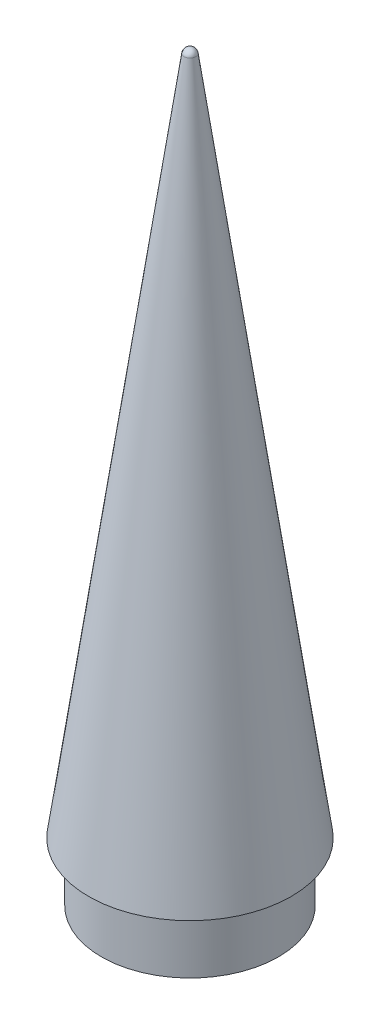
ISO-10303-21;
HEADER;
FILE_DESCRIPTION(('STEP AP214'),'2;1');
FILE_NAME('part.step','',(''),(''),'','','');
FILE_SCHEMA(('AUTOMOTIVE_DESIGN { 1 0 10303 214 1 1 1 1 }'));
ENDSEC;
DATA;
#1=APPLICATION_CONTEXT('core data for automotive mechanical design processes');
#2=APPLICATION_PROTOCOL_DEFINITION('international standard','automotive_design',2000,#1);
#3=PRODUCT_CONTEXT('',#1,'mechanical');
#4=PRODUCT('Part','Part','',(#3));
#5=PRODUCT_RELATED_PRODUCT_CATEGORY('part','',(#4));
#6=PRODUCT_DEFINITION_FORMATION('','',#4);
#7=PRODUCT_DEFINITION_CONTEXT('part definition',#1,'design');
#8=PRODUCT_DEFINITION('design','',#6,#7);
#9=PRODUCT_DEFINITION_SHAPE('','',#8);
#10=(LENGTH_UNIT() NAMED_UNIT(*) SI_UNIT(.MILLI.,.METRE.));
#11=(NAMED_UNIT(*) PLANE_ANGLE_UNIT() SI_UNIT($,.RADIAN.));
#12=(NAMED_UNIT(*) SI_UNIT($,.STERADIAN.) SOLID_ANGLE_UNIT());
#13=UNCERTAINTY_MEASURE_WITH_UNIT(LENGTH_MEASURE(1.E-05),#10,'distance_accuracy_value','');
#14=(GEOMETRIC_REPRESENTATION_CONTEXT(3) GLOBAL_UNCERTAINTY_ASSIGNED_CONTEXT((#13)) GLOBAL_UNIT_ASSIGNED_CONTEXT((#10,
#11,#12)) REPRESENTATION_CONTEXT('',''));
#15=CARTESIAN_POINT('',(0.,0.,0.));
#16=DIRECTION('',(0.,0.,1.));
#17=DIRECTION('',(1.,0.,0.));
#18=AXIS2_PLACEMENT_3D('',#15,#16,#17);
#19=CARTESIAN_POINT('',(0.,159.635365985492,0.));
#20=DIRECTION('',(0.,-1.,0.));
#21=DIRECTION('',(-1.,0.,0.));
#22=AXIS2_PLACEMENT_3D('',#19,#20,#21);
#23=SPHERICAL_SURFACE('',#22,1.27);
#24=CARTESIAN_POINT('',(0.,159.812115823711,0.));
#25=DIRECTION('',(0.,-1.,0.));
#26=DIRECTION('',(1.,0.,0.));
#27=AXIS2_PLACEMENT_3D('',#24,#25,#26);
#28=CIRCLE('',#27,1.25764044730179);
#29=CARTESIAN_POINT('',(1.25764044730179,159.812115823711,0.));
#30=VERTEX_POINT('',#29);
#31=EDGE_CURVE('E75',#30,#30,#28,.T.);
#32=ORIENTED_EDGE('',*,*,#31,.F.);
#33=EDGE_LOOP('',(#32));
#34=FACE_BOUND('',#33,.T.);
#35=ADVANCED_FACE('F53',(#34),#23,.T.);
#36=CARTESIAN_POINT('',(0.,0.,0.));
#37=DIRECTION('',(0.,1.,0.));
#38=DIRECTION('',(-1.,0.,0.));
#39=AXIS2_PLACEMENT_3D('',#36,#37,#38);
#40=PLANE('',#39);
#41=CARTESIAN_POINT('',(0.,0.,0.));
#42=DIRECTION('',(0.,-1.,0.));
#43=DIRECTION('',(0.,0.,-1.));
#44=AXIS2_PLACEMENT_3D('',#41,#42,#43);
#45=CIRCLE('',#44,2.55269999999999);
#46=CARTESIAN_POINT('',(0.,0.,-2.55269999999999));
#47=VERTEX_POINT('',#46);
#48=EDGE_CURVE('E76',#47,#47,#45,.T.);
#49=ORIENTED_EDGE('',*,*,#48,.F.);
#50=EDGE_LOOP('',(#49));
#51=FACE_BOUND('',#50,.T.);
#52=CARTESIAN_POINT('',(0.,0.,0.));
#53=DIRECTION('',(0.,-1.,0.));
#54=DIRECTION('',(1.,0.,0.));
#55=AXIS2_PLACEMENT_3D('',#52,#53,#54);
#56=CIRCLE('',#55,19.177);
#57=CARTESIAN_POINT('',(19.177,0.,0.));
#58=VERTEX_POINT('',#57);
#59=EDGE_CURVE('E11',#58,#58,#56,.T.);
#60=ORIENTED_EDGE('',*,*,#59,.T.);
#61=EDGE_LOOP('',(#60));
#62=FACE_BOUND('',#61,.T.);
#63=ADVANCED_FACE('F108',(#51,#62),#40,.F.);
#64=CARTESIAN_POINT('',(0.,0.,0.));
#65=DIRECTION('',(0.,-1.,0.));
#66=DIRECTION('',(1.,0.,0.));
#67=AXIS2_PLACEMENT_3D('',#64,#65,#66);
#68=CYLINDRICAL_SURFACE('',#67,19.177);
#69=ORIENTED_EDGE('',*,*,#59,.F.);
#70=EDGE_LOOP('',(#69));
#71=FACE_BOUND('',#70,.T.);
#72=CARTESIAN_POINT('',(0.,12.7,0.));
#73=DIRECTION('',(0.,-1.,0.));
#74=DIRECTION('',(1.,0.,0.));
#75=AXIS2_PLACEMENT_3D('',#72,#73,#74);
#76=CIRCLE('',#75,19.177);
#77=CARTESIAN_POINT('',(19.177,12.7,0.));
#78=VERTEX_POINT('',#77);
#79=EDGE_CURVE('E60',#78,#78,#76,.T.);
#80=ORIENTED_EDGE('',*,*,#79,.T.);
#81=EDGE_LOOP('',(#80));
#82=FACE_BOUND('',#81,.T.);
#83=ADVANCED_FACE('F94',(#71,#82),#68,.T.);
#84=CARTESIAN_POINT('',(0.,12.7,0.));
#85=DIRECTION('',(0.,1.,0.));
#86=DIRECTION('',(-1.,0.,0.));
#87=AXIS2_PLACEMENT_3D('',#84,#85,#86);
#88=PLANE('',#87);
#89=ORIENTED_EDGE('',*,*,#79,.F.);
#90=EDGE_LOOP('',(#89));
#91=FACE_BOUND('',#90,.T.);
#92=CARTESIAN_POINT('',(0.,12.7,0.));
#93=DIRECTION('',(0.,-1.,0.));
#94=DIRECTION('',(1.,0.,0.));
#95=AXIS2_PLACEMENT_3D('',#92,#93,#94);
#96=CIRCLE('',#95,21.9329);
#97=CARTESIAN_POINT('',(21.9329,12.7,0.));
#98=VERTEX_POINT('',#97);
#99=EDGE_CURVE('E82',#98,#98,#96,.T.);
#100=ORIENTED_EDGE('',*,*,#99,.T.);
#101=EDGE_LOOP('',(#100));
#102=FACE_BOUND('',#101,.T.);
#103=ADVANCED_FACE('F96',(#91,#102),#88,.F.);
#104=CARTESIAN_POINT('',(0.,159.812115823711,0.));
#105=DIRECTION('',(0.,-1.,0.));
#106=DIRECTION('',(1.,0.,0.));
#107=AXIS2_PLACEMENT_3D('',#104,#105,#106);
#108=CONICAL_SURFACE('',#107,1.25764044730179,0.13962634015954);
#109=CARTESIAN_POINT('',(21.9329,12.7,0.));
#110=CARTESIAN_POINT('',(21.7175327129927,14.2324178731636,0.));
#111=CARTESIAN_POINT('',(21.5021654259854,15.7648357463273,0.));
#112=CARTESIAN_POINT('',(21.0714308519709,18.8296714926546,0.));
#113=CARTESIAN_POINT('',(20.8560635649636,20.3620893658183,0.));
#114=CARTESIAN_POINT('',(20.4253289909491,23.4269251121456,0.));
#115=CARTESIAN_POINT('',(20.2099617039418,24.9593429853092,0.));
#116=CARTESIAN_POINT('',(19.7792271299273,28.0241787316365,0.));
#117=CARTESIAN_POINT('',(19.56385984292,29.5565966048002,0.));
#118=CARTESIAN_POINT('',(19.1331252689054,32.6214323511275,0.));
#119=CARTESIAN_POINT('',(18.9177579818982,34.1538502242912,0.));
#120=CARTESIAN_POINT('',(18.4870234078836,37.2186859706185,0.));
#121=CARTESIAN_POINT('',(18.2716561208764,38.7511038437821,0.));
#122=CARTESIAN_POINT('',(17.8409215468618,41.8159395901094,0.));
#123=CARTESIAN_POINT('',(17.6255542598545,43.3483574632731,0.));
#124=CARTESIAN_POINT('',(17.19481968584,46.4131932096004,0.));
#125=CARTESIAN_POINT('',(16.9794523988327,47.9456110827641,0.));
#126=CARTESIAN_POINT('',(16.5487178248182,51.0104468290914,0.));
#127=CARTESIAN_POINT('',(16.3333505378109,52.542864702255,0.));
#128=CARTESIAN_POINT('',(15.9026159637963,55.6077004485823,0.));
#129=CARTESIAN_POINT('',(15.6872486767891,57.140118321746,0.));
#130=CARTESIAN_POINT('',(15.2565141027745,60.2049540680733,0.));
#131=CARTESIAN_POINT('',(15.0411468157673,61.737371941237,0.));
#132=CARTESIAN_POINT('',(14.6104122417527,64.8022076875643,0.));
#133=CARTESIAN_POINT('',(14.3950449547454,66.3346255607279,0.));
#134=CARTESIAN_POINT('',(13.9643103807309,69.3994613070552,0.));
#135=CARTESIAN_POINT('',(13.7489430937236,70.9318791802189,0.));
#136=CARTESIAN_POINT('',(13.3182085197091,73.9967149265462,0.));
#137=CARTESIAN_POINT('',(13.1028412327018,75.5291327997099,0.));
#138=CARTESIAN_POINT('',(12.6721066586873,78.5939685460372,0.));
#139=CARTESIAN_POINT('',(12.45673937168,80.1263864192008,0.));
#140=CARTESIAN_POINT('',(12.0260047976654,83.1912221655281,0.));
#141=CARTESIAN_POINT('',(11.8106375106582,84.7236400386918,0.));
#142=CARTESIAN_POINT('',(11.3799029366436,87.7884757850191,0.));
#143=CARTESIAN_POINT('',(11.1645356496363,89.3208936581828,0.));
#144=CARTESIAN_POINT('',(10.7338010756218,92.3857294045101,0.));
#145=CARTESIAN_POINT('',(10.5184337886145,93.9181472776737,0.));
#146=CARTESIAN_POINT('',(10.0876992146,96.982983024001,0.));
#147=CARTESIAN_POINT('',(9.87233192759271,98.5154008971647,0.));
#148=CARTESIAN_POINT('',(9.44159735357816,101.580236643492,0.));
#149=CARTESIAN_POINT('',(9.22623006657089,103.112654516656,0.));
#150=CARTESIAN_POINT('',(8.79549549255634,106.177490262983,0.));
#151=CARTESIAN_POINT('',(8.58012820554907,107.709908136147,0.));
#152=CARTESIAN_POINT('',(8.14939363153453,110.774743882474,0.));
#153=CARTESIAN_POINT('',(7.93402634452725,112.307161755638,0.));
#154=CARTESIAN_POINT('',(7.50329177051271,115.371997501965,0.));
#155=CARTESIAN_POINT('',(7.28792448350543,116.904415375129,0.));
#156=CARTESIAN_POINT('',(6.85718990949089,119.969251121456,0.));
#157=CARTESIAN_POINT('',(6.64182262248361,121.50166899462,0.));
#158=CARTESIAN_POINT('',(6.21108804846907,124.566504740947,0.));
#159=CARTESIAN_POINT('',(5.9957207614618,126.09892261411,0.));
#160=CARTESIAN_POINT('',(5.56498618744725,129.163758360438,0.));
#161=CARTESIAN_POINT('',(5.34961890043998,130.696176233601,0.));
#162=CARTESIAN_POINT('',(4.91888432642543,133.761011979929,0.));
#163=CARTESIAN_POINT('',(4.70351703941816,135.293429853092,0.));
#164=CARTESIAN_POINT('',(4.27278246540361,138.35826559942,0.));
#165=CARTESIAN_POINT('',(4.05741517839634,139.890683472583,0.));
#166=CARTESIAN_POINT('',(3.62668060438179,142.955519218911,0.));
#167=CARTESIAN_POINT('',(3.41131331737452,144.487937092074,0.));
#168=CARTESIAN_POINT('',(2.98057874335997,147.552772838402,0.));
#169=CARTESIAN_POINT('',(2.7652114563527,149.085190711565,0.));
#170=CARTESIAN_POINT('',(2.33447688233816,152.150026457893,0.));
#171=CARTESIAN_POINT('',(2.11910959533088,153.682444331056,0.));
#172=CARTESIAN_POINT('',(1.68837502131634,156.747280077384,0.));
#173=CARTESIAN_POINT('',(1.47300773430907,158.279697950547,0.));
#174=CARTESIAN_POINT('',(1.25764044730179,159.812115823711,0.));
#175=B_SPLINE_CURVE_WITH_KNOTS('',3,(#109,#110,#111,#112,#113,#114,#115,#116,#117,#118,#119,
#120,#121,#122,#123,#124,#125,#126,#127,#128,#129,#130,#131,#132,#133,#134,#135,#136,#137,#138,
#139,#140,#141,#142,#143,#144,#145,#146,#147,#148,#149,#150,#151,#152,#153,#154,#155,#156,#157,
#158,#159,#160,#161,#162,#163,#164,#165,#166,#167,#168,#169,#170,#171,#172,#173,#174),
.UNSPECIFIED.,.F.,.F.,(4,2,2,2,2,2,2,2,2,2,2,2,2,2,2,2,2,2,2,2,2,2,2,2,2,2,2,2,2,2,2,2,4),(0.,
4.64243346282298,9.28486692564598,13.927300388469,18.569733851292,23.2121673141149,
27.8546007769379,32.4970342397609,37.1394677025839,41.7819011654069,46.4243346282299,
51.0667680910529,55.7092015538759,60.3516350166989,64.9940684795218,69.6365019423448,
74.2789354051678,78.9213688679908,83.5638023308138,88.2062357936368,92.8486692564598,
97.4911027192828,102.133536182106,106.775969644929,111.418403107752,116.060836570575,
120.703270033398,125.345703496221,129.988136959044,134.630570421867,139.27300388469,
143.915437347513,148.557870810336),.UNSPECIFIED.);
#176=EDGE_CURVE('BSEAM68',#98,#30,#175,.T.);
#177=ORIENTED_EDGE('',*,*,#99,.F.);
#178=ORIENTED_EDGE('',*,*,#31,.T.);
#179=ORIENTED_EDGE('',*,*,#176,.T.);
#180=ORIENTED_EDGE('',*,*,#176,.F.);
#181=EDGE_LOOP('',(#177,#179,#178,#180));
#182=FACE_BOUND('',#181,.T.);
#183=ADVANCED_FACE('F68',(#182),#108,.T.);
#184=CARTESIAN_POINT('',(0.,19.05,0.));
#185=DIRECTION('',(0.,-1.,0.));
#186=DIRECTION('',(0.,0.,-1.));
#187=AXIS2_PLACEMENT_3D('',#184,#185,#186);
#188=CONICAL_SURFACE('',#187,2.5527,1.02974425867665);
#189=CARTESIAN_POINT('',(0.,20.5838169021917,0.));
#190=VERTEX_POINT('',#189);
#191=VERTEX_LOOP('',#190);
#192=FACE_BOUND('',#191,.T.);
#193=CARTESIAN_POINT('',(0.,19.05,0.));
#194=DIRECTION('',(0.,-1.,0.));
#195=DIRECTION('',(0.,0.,-1.));
#196=AXIS2_PLACEMENT_3D('',#193,#194,#195);
#197=CIRCLE('',#196,2.5527);
#198=CARTESIAN_POINT('',(0.,19.05,-2.5527));
#199=VERTEX_POINT('',#198);
#200=EDGE_CURVE('E72',#199,#199,#197,.T.);
#201=ORIENTED_EDGE('',*,*,#200,.T.);
#202=EDGE_LOOP('',(#201));
#203=FACE_BOUND('',#202,.T.);
#204=ADVANCED_FACE('F64',(#192,#203),#188,.F.);
#205=CARTESIAN_POINT('',(0.,0.,0.));
#206=DIRECTION('',(0.,-1.,0.));
#207=DIRECTION('',(0.,0.,-1.));
#208=AXIS2_PLACEMENT_3D('',#205,#206,#207);
#209=CYLINDRICAL_SURFACE('',#208,2.55269999999999);
#210=ORIENTED_EDGE('',*,*,#200,.F.);
#211=EDGE_LOOP('',(#210));
#212=FACE_BOUND('',#211,.T.);
#213=ORIENTED_EDGE('',*,*,#48,.T.);
#214=EDGE_LOOP('',(#213));
#215=FACE_BOUND('',#214,.T.);
#216=ADVANCED_FACE('F67',(#212,#215),#209,.F.);
#217=CLOSED_SHELL('',(#35,#63,#83,#103,#183,#204,#216));
#218=MANIFOLD_SOLID_BREP('B2',#217);
#219=ADVANCED_BREP_SHAPE_REPRESENTATION('',(#18,#218),#14);
#220=SHAPE_DEFINITION_REPRESENTATION(#9,#219);
ENDSEC;
END-ISO-10303-21;
